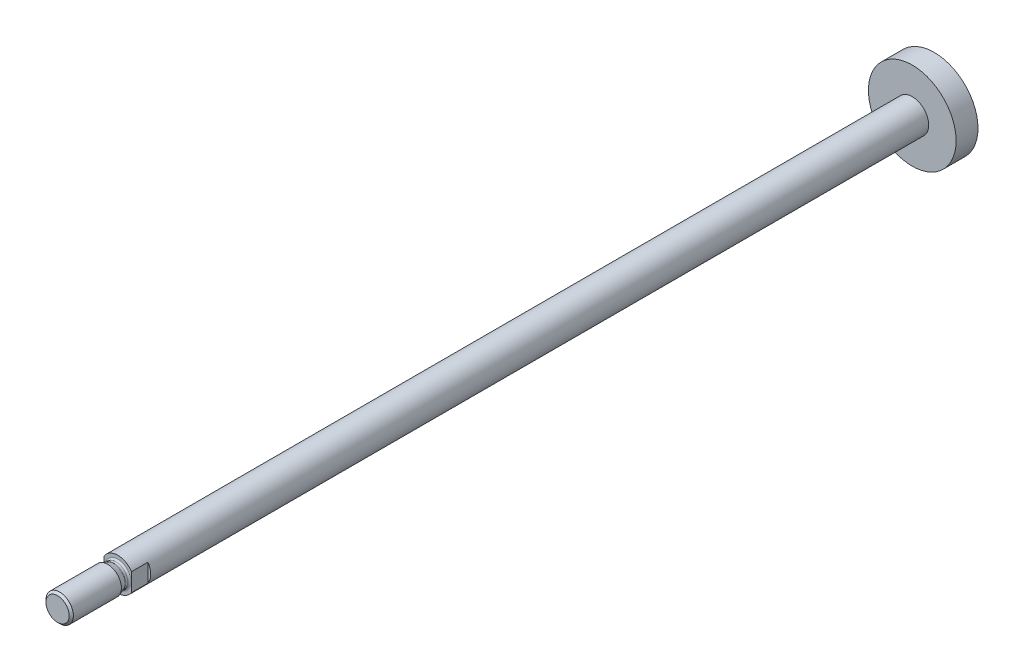
ISO-10303-21;
HEADER;
FILE_DESCRIPTION(('STEP AP214'),'2;1');
FILE_NAME('part.step','',(''),(''),'','','');
FILE_SCHEMA(('AUTOMOTIVE_DESIGN { 1 0 10303 214 1 1 1 1 }'));
ENDSEC;
DATA;
#1=APPLICATION_CONTEXT('core data for automotive mechanical design processes');
#2=APPLICATION_PROTOCOL_DEFINITION('international standard','automotive_design',2000,#1);
#3=PRODUCT_CONTEXT('',#1,'mechanical');
#4=PRODUCT('Part','Part','',(#3));
#5=PRODUCT_RELATED_PRODUCT_CATEGORY('part','',(#4));
#6=PRODUCT_DEFINITION_FORMATION('','',#4);
#7=PRODUCT_DEFINITION_CONTEXT('part definition',#1,'design');
#8=PRODUCT_DEFINITION('design','',#6,#7);
#9=PRODUCT_DEFINITION_SHAPE('','',#8);
#10=(LENGTH_UNIT() NAMED_UNIT(*) SI_UNIT(.MILLI.,.METRE.));
#11=(NAMED_UNIT(*) PLANE_ANGLE_UNIT() SI_UNIT($,.RADIAN.));
#12=(NAMED_UNIT(*) SI_UNIT($,.STERADIAN.) SOLID_ANGLE_UNIT());
#13=UNCERTAINTY_MEASURE_WITH_UNIT(LENGTH_MEASURE(1.E-05),#10,'distance_accuracy_value','');
#14=(GEOMETRIC_REPRESENTATION_CONTEXT(3) GLOBAL_UNCERTAINTY_ASSIGNED_CONTEXT((#13)) GLOBAL_UNIT_ASSIGNED_CONTEXT((#10,
#11,#12)) REPRESENTATION_CONTEXT('',''));
#15=CARTESIAN_POINT('',(0.,0.,0.));
#16=DIRECTION('',(0.,0.,1.));
#17=DIRECTION('',(1.,0.,0.));
#18=AXIS2_PLACEMENT_3D('',#15,#16,#17);
#19=CARTESIAN_POINT('',(0.,0.,8.));
#20=DIRECTION('',(0.,0.,-1.));
#21=DIRECTION('',(-1.,0.,0.));
#22=AXIS2_PLACEMENT_3D('',#19,#20,#21);
#23=PLANE('',#22);
#24=CARTESIAN_POINT('',(0.,0.,8.));
#25=DIRECTION('',(0.,0.,1.));
#26=DIRECTION('',(1.,0.,0.));
#27=AXIS2_PLACEMENT_3D('',#24,#25,#26);
#28=CIRCLE('',#27,4.8000000000001);
#29=CARTESIAN_POINT('',(4.8000000000001,0.,8.));
#30=VERTEX_POINT('',#29);
#31=EDGE_CURVE('E81',#30,#30,#28,.T.);
#32=ORIENTED_EDGE('',*,*,#31,.F.);
#33=EDGE_LOOP('',(#32));
#34=FACE_BOUND('',#33,.T.);
#35=DIRECTION('',(0.,1.,0.));
#36=VECTOR('',#35,1.);
#37=CARTESIAN_POINT('',(-5.,0.,8.));
#38=LINE('',#37,#36);
#39=CARTESIAN_POINT('',(-5.,-3.3166247903554,8.00000000000001));
#40=VERTEX_POINT('',#39);
#41=CARTESIAN_POINT('',(-5.,3.3166247903554,8.00000000000001));
#42=VERTEX_POINT('',#41);
#43=EDGE_CURVE('E102',#40,#42,#38,.T.);
#44=ORIENTED_EDGE('',*,*,#43,.F.);
#45=CARTESIAN_POINT('',(0.,0.,8.00000000000001));
#46=DIRECTION('',(0.,0.,1.));
#47=DIRECTION('',(1.,0.,0.));
#48=AXIS2_PLACEMENT_3D('',#45,#46,#47);
#49=CIRCLE('',#48,6.);
#50=CARTESIAN_POINT('',(5.,-3.3166247903554,8.00000000000001));
#51=VERTEX_POINT('',#50);
#52=EDGE_CURVE('E125',#40,#51,#49,.T.);
#53=ORIENTED_EDGE('',*,*,#52,.T.);
#54=DIRECTION('',(0.,-1.,0.));
#55=VECTOR('',#54,1.);
#56=CARTESIAN_POINT('',(5.,0.,8.));
#57=LINE('',#56,#55);
#58=CARTESIAN_POINT('',(5.,3.3166247903554,8.00000000000001));
#59=VERTEX_POINT('',#58);
#60=EDGE_CURVE('E88',#59,#51,#57,.T.);
#61=ORIENTED_EDGE('',*,*,#60,.F.);
#62=EDGE_CURVE('E95',#59,#42,#49,.T.);
#63=ORIENTED_EDGE('',*,*,#62,.T.);
#64=EDGE_LOOP('',(#44,#53,#61,#63));
#65=FACE_BOUND('',#64,.T.);
#66=ADVANCED_FACE('F38',(#34,#65),#23,.F.);
#67=CARTESIAN_POINT('',(0.,0.,-290.));
#68=DIRECTION('',(0.,0.,1.));
#69=DIRECTION('',(1.,0.,0.));
#70=AXIS2_PLACEMENT_3D('',#67,#68,#69);
#71=CYLINDRICAL_SURFACE('',#70,6.);
#72=CARTESIAN_POINT('',(0.,0.,-282.));
#73=DIRECTION('',(0.,0.,1.));
#74=DIRECTION('',(1.,0.,0.));
#75=AXIS2_PLACEMENT_3D('',#72,#73,#74);
#76=CIRCLE('',#75,6.);
#77=CARTESIAN_POINT('',(6.,0.,-282.));
#78=VERTEX_POINT('',#77);
#79=EDGE_CURVE('E128',#78,#78,#76,.T.);
#80=ORIENTED_EDGE('',*,*,#79,.T.);
#81=EDGE_LOOP('',(#80));
#82=FACE_BOUND('',#81,.T.);
#83=DIRECTION('',(0.,0.,1.));
#84=VECTOR('',#83,1.);
#85=CARTESIAN_POINT('',(-5.,-3.3166247903554,-290.));
#86=LINE('',#85,#84);
#87=CARTESIAN_POINT('',(-5.,-3.3166247903554,2.));
#88=VERTEX_POINT('',#87);
#89=EDGE_CURVE('E11',#88,#40,#86,.T.);
#90=ORIENTED_EDGE('',*,*,#89,.F.);
#91=CARTESIAN_POINT('',(0.,0.,2.));
#92=DIRECTION('',(0.,0.,1.));
#93=DIRECTION('',(1.,0.,0.));
#94=AXIS2_PLACEMENT_3D('',#91,#92,#93);
#95=CIRCLE('',#94,6.);
#96=CARTESIAN_POINT('',(-5.,3.3166247903554,2.));
#97=VERTEX_POINT('',#96);
#98=EDGE_CURVE('E83',#97,#88,#95,.T.);
#99=ORIENTED_EDGE('',*,*,#98,.F.);
#100=DIRECTION('',(0.,0.,1.));
#101=VECTOR('',#100,1.);
#102=CARTESIAN_POINT('',(-5.,3.3166247903554,-290.));
#103=LINE('',#102,#101);
#104=EDGE_CURVE('E45',#42,#97,#103,.F.);
#105=ORIENTED_EDGE('',*,*,#104,.F.);
#106=ORIENTED_EDGE('',*,*,#62,.F.);
#107=DIRECTION('',(0.,0.,1.));
#108=VECTOR('',#107,1.);
#109=CARTESIAN_POINT('',(5.,3.3166247903554,-290.));
#110=LINE('',#109,#108);
#111=CARTESIAN_POINT('',(5.,3.3166247903554,2.));
#112=VERTEX_POINT('',#111);
#113=EDGE_CURVE('E86',#112,#59,#110,.T.);
#114=ORIENTED_EDGE('',*,*,#113,.F.);
#115=CARTESIAN_POINT('',(5.,-3.3166247903554,2.));
#116=VERTEX_POINT('',#115);
#117=EDGE_CURVE('E75',#116,#112,#95,.T.);
#118=ORIENTED_EDGE('',*,*,#117,.F.);
#119=DIRECTION('',(0.,0.,1.));
#120=VECTOR('',#119,1.);
#121=CARTESIAN_POINT('',(5.,-3.3166247903554,-290.));
#122=LINE('',#121,#120);
#123=EDGE_CURVE('E80',#51,#116,#122,.F.);
#124=ORIENTED_EDGE('',*,*,#123,.F.);
#125=ORIENTED_EDGE('',*,*,#52,.F.);
#126=EDGE_LOOP('',(#90,#99,#105,#106,#114,#118,#124,#125));
#127=FACE_BOUND('',#126,.T.);
#128=ADVANCED_FACE('F92',(#82,#127),#71,.T.);
#129=CARTESIAN_POINT('',(0.,6.,-282.));
#130=DIRECTION('',(0.,0.,-1.));
#131=DIRECTION('',(-1.,0.,0.));
#132=AXIS2_PLACEMENT_3D('',#129,#130,#131);
#133=PLANE('',#132);
#134=ORIENTED_EDGE('',*,*,#79,.F.);
#135=EDGE_LOOP('',(#134));
#136=FACE_BOUND('',#135,.T.);
#137=CARTESIAN_POINT('',(0.,0.,-282.));
#138=DIRECTION('',(0.,0.,1.));
#139=DIRECTION('',(1.,0.,0.));
#140=AXIS2_PLACEMENT_3D('',#137,#138,#139);
#141=CIRCLE('',#140,16.);
#142=CARTESIAN_POINT('',(16.,0.,-282.));
#143=VERTEX_POINT('',#142);
#144=EDGE_CURVE('E131',#143,#143,#141,.T.);
#145=ORIENTED_EDGE('',*,*,#144,.T.);
#146=EDGE_LOOP('',(#145));
#147=FACE_BOUND('',#146,.T.);
#148=ADVANCED_FACE('F119',(#136,#147),#133,.F.);
#149=CARTESIAN_POINT('',(0.,0.,-290.));
#150=DIRECTION('',(0.,0.,1.));
#151=DIRECTION('',(1.,0.,0.));
#152=AXIS2_PLACEMENT_3D('',#149,#150,#151);
#153=CYLINDRICAL_SURFACE('',#152,16.);
#154=ORIENTED_EDGE('',*,*,#144,.F.);
#155=EDGE_LOOP('',(#154));
#156=FACE_BOUND('',#155,.T.);
#157=CARTESIAN_POINT('',(0.,0.,-290.));
#158=DIRECTION('',(0.,0.,1.));
#159=DIRECTION('',(1.,0.,0.));
#160=AXIS2_PLACEMENT_3D('',#157,#158,#159);
#161=CIRCLE('',#160,16.);
#162=CARTESIAN_POINT('',(16.,0.,-290.));
#163=VERTEX_POINT('',#162);
#164=EDGE_CURVE('E166',#163,#163,#161,.T.);
#165=ORIENTED_EDGE('',*,*,#164,.T.);
#166=EDGE_LOOP('',(#165));
#167=FACE_BOUND('',#166,.T.);
#168=ADVANCED_FACE('F149',(#156,#167),#153,.T.);
#169=CARTESIAN_POINT('',(0.,16.,-290.));
#170=DIRECTION('',(0.,0.,1.));
#171=DIRECTION('',(1.,0.,0.));
#172=AXIS2_PLACEMENT_3D('',#169,#170,#171);
#173=PLANE('',#172);
#174=ORIENTED_EDGE('',*,*,#164,.F.);
#175=EDGE_LOOP('',(#174));
#176=FACE_BOUND('',#175,.T.);
#177=ADVANCED_FACE('F139',(#176),#173,.F.);
#178=CARTESIAN_POINT('',(0.,0.,8.6000000000001));
#179=DIRECTION('',(0.,0.,1.));
#180=DIRECTION('',(1.,0.,0.));
#181=AXIS2_PLACEMENT_3D('',#178,#179,#180);
#182=TOROIDAL_SURFACE('',#181,4.8000000000001,0.600000000000098);
#183=CARTESIAN_POINT('',(0.,0.,8.6));
#184=DIRECTION('',(0.,0.,1.));
#185=DIRECTION('',(1.,0.,0.));
#186=AXIS2_PLACEMENT_3D('',#183,#184,#185);
#187=CIRCLE('',#186,4.2);
#188=CARTESIAN_POINT('',(4.2,0.,8.6));
#189=VERTEX_POINT('',#188);
#190=EDGE_CURVE('E168',#189,#189,#187,.T.);
#191=ORIENTED_EDGE('',*,*,#190,.F.);
#192=EDGE_LOOP('',(#191));
#193=FACE_BOUND('',#192,.T.);
#194=ORIENTED_EDGE('',*,*,#31,.T.);
#195=EDGE_LOOP('',(#194));
#196=FACE_BOUND('',#195,.T.);
#197=ADVANCED_FACE('F136',(#193,#196),#182,.F.);
#198=CARTESIAN_POINT('',(0.,0.,7.));
#199=DIRECTION('',(0.,0.,1.));
#200=DIRECTION('',(1.,0.,0.));
#201=AXIS2_PLACEMENT_3D('',#198,#199,#200);
#202=CYLINDRICAL_SURFACE('',#201,4.2);
#203=CARTESIAN_POINT('',(0.,0.,9.3942038115749));
#204=DIRECTION('',(0.,0.,1.));
#205=DIRECTION('',(1.,0.,0.));
#206=AXIS2_PLACEMENT_3D('',#203,#204,#205);
#207=CIRCLE('',#206,4.2);
#208=CARTESIAN_POINT('',(4.2,0.,9.3942038115749));
#209=VERTEX_POINT('',#208);
#210=EDGE_CURVE('E173',#209,#209,#207,.T.);
#211=ORIENTED_EDGE('',*,*,#210,.F.);
#212=EDGE_LOOP('',(#211));
#213=FACE_BOUND('',#212,.T.);
#214=ORIENTED_EDGE('',*,*,#190,.T.);
#215=EDGE_LOOP('',(#214));
#216=FACE_BOUND('',#215,.T.);
#217=ADVANCED_FACE('F138',(#213,#216),#202,.T.);
#218=CARTESIAN_POINT('',(0.,0.,9.39420381157482));
#219=DIRECTION('',(0.,0.,1.));
#220=DIRECTION('',(1.,0.,0.));
#221=AXIS2_PLACEMENT_3D('',#218,#219,#220);
#222=TOROIDAL_SURFACE('',#221,4.79999999999972,0.59999999999972);
#223=CARTESIAN_POINT('',(0.,0.,9.5994158975703));
#224=DIRECTION('',(0.,0.,1.));
#225=DIRECTION('',(1.,0.,0.));
#226=AXIS2_PLACEMENT_3D('',#223,#224,#225);
#227=CIRCLE('',#226,4.2361844275285);
#228=CARTESIAN_POINT('',(4.2361844275285,0.,9.5994158975703));
#229=VERTEX_POINT('',#228);
#230=EDGE_CURVE('E176',#229,#229,#227,.T.);
#231=ORIENTED_EDGE('',*,*,#230,.F.);
#232=EDGE_LOOP('',(#231));
#233=FACE_BOUND('',#232,.T.);
#234=ORIENTED_EDGE('',*,*,#210,.T.);
#235=EDGE_LOOP('',(#234));
#236=FACE_BOUND('',#235,.T.);
#237=ADVANCED_FACE('F146',(#233,#236),#222,.F.);
#238=CARTESIAN_POINT('',(0.,0.,9.5994158975703));
#239=DIRECTION('',(0.,0.,1.));
#240=DIRECTION('',(1.,0.,0.));
#241=AXIS2_PLACEMENT_3D('',#238,#239,#240);
#242=CONICAL_SURFACE('',#241,4.2361844275285,0.349065850398797);
#243=CARTESIAN_POINT('',(0.,0.,11.697981935564));
#244=DIRECTION('',(0.,0.,1.));
#245=DIRECTION('',(1.,0.,0.));
#246=AXIS2_PLACEMENT_3D('',#243,#244,#245);
#247=CIRCLE('',#246,5.);
#248=CARTESIAN_POINT('',(5.,0.,11.697981935564));
#249=VERTEX_POINT('',#248);
#250=EDGE_CURVE('E179',#249,#249,#247,.T.);
#251=ORIENTED_EDGE('',*,*,#250,.F.);
#252=EDGE_LOOP('',(#251));
#253=FACE_BOUND('',#252,.T.);
#254=ORIENTED_EDGE('',*,*,#230,.T.);
#255=EDGE_LOOP('',(#254));
#256=FACE_BOUND('',#255,.T.);
#257=ADVANCED_FACE('F200',(#253,#256),#242,.T.);
#258=CARTESIAN_POINT('',(0.,0.,7.));
#259=DIRECTION('',(0.,0.,1.));
#260=DIRECTION('',(1.,0.,0.));
#261=AXIS2_PLACEMENT_3D('',#258,#259,#260);
#262=CYLINDRICAL_SURFACE('',#261,5.);
#263=CARTESIAN_POINT('',(0.,0.,29.233));
#264=DIRECTION('',(0.,0.,1.));
#265=DIRECTION('',(1.,0.,0.));
#266=AXIS2_PLACEMENT_3D('',#263,#264,#265);
#267=CIRCLE('',#266,5.);
#268=CARTESIAN_POINT('',(5.,0.,29.233));
#269=VERTEX_POINT('',#268);
#270=EDGE_CURVE('E182',#269,#269,#267,.T.);
#271=ORIENTED_EDGE('',*,*,#270,.F.);
#272=EDGE_LOOP('',(#271));
#273=FACE_BOUND('',#272,.T.);
#274=ORIENTED_EDGE('',*,*,#250,.T.);
#275=EDGE_LOOP('',(#274));
#276=FACE_BOUND('',#275,.T.);
#277=ADVANCED_FACE('F194',(#273,#276),#262,.T.);
#278=CARTESIAN_POINT('',(0.,0.,29.233));
#279=DIRECTION('',(0.,0.,-1.));
#280=DIRECTION('',(-1.,0.,0.));
#281=AXIS2_PLACEMENT_3D('',#278,#279,#280);
#282=CONICAL_SURFACE('',#281,5.,0.785398163397451);
#283=CARTESIAN_POINT('',(0.,0.,30.));
#284=DIRECTION('',(0.,0.,1.));
#285=DIRECTION('',(1.,0.,0.));
#286=AXIS2_PLACEMENT_3D('',#283,#284,#285);
#287=CIRCLE('',#286,4.233);
#288=CARTESIAN_POINT('',(4.233,0.,30.));
#289=VERTEX_POINT('',#288);
#290=EDGE_CURVE('E126',#289,#289,#287,.T.);
#291=ORIENTED_EDGE('',*,*,#290,.F.);
#292=EDGE_LOOP('',(#291));
#293=FACE_BOUND('',#292,.T.);
#294=ORIENTED_EDGE('',*,*,#270,.T.);
#295=EDGE_LOOP('',(#294));
#296=FACE_BOUND('',#295,.T.);
#297=ADVANCED_FACE('F191',(#293,#296),#282,.T.);
#298=CARTESIAN_POINT('',(0.,0.,30.));
#299=DIRECTION('',(0.,0.,-1.));
#300=DIRECTION('',(-1.,0.,0.));
#301=AXIS2_PLACEMENT_3D('',#298,#299,#300);
#302=PLANE('',#301);
#303=ORIENTED_EDGE('',*,*,#290,.T.);
#304=EDGE_LOOP('',(#303));
#305=FACE_BOUND('',#304,.T.);
#306=ADVANCED_FACE('F113',(#305),#302,.F.);
#307=CARTESIAN_POINT('',(0.,0.,2.));
#308=DIRECTION('',(0.,0.,1.));
#309=DIRECTION('',(1.,0.,0.));
#310=AXIS2_PLACEMENT_3D('',#307,#308,#309);
#311=PLANE('',#310);
#312=ORIENTED_EDGE('',*,*,#117,.T.);
#313=DIRECTION('',(0.,-1.,0.));
#314=VECTOR('',#313,1.);
#315=CARTESIAN_POINT('',(5.,10.,2.));
#316=LINE('',#315,#314);
#317=EDGE_CURVE('E58',#112,#116,#316,.T.);
#318=ORIENTED_EDGE('',*,*,#317,.T.);
#319=EDGE_LOOP('',(#312,#318));
#320=FACE_BOUND('',#319,.T.);
#321=ADVANCED_FACE('F76',(#320),#311,.T.);
#322=CARTESIAN_POINT('',(5.,10.,9.));
#323=DIRECTION('',(1.,0.,0.));
#324=DIRECTION('',(0.,0.,-1.));
#325=AXIS2_PLACEMENT_3D('',#322,#323,#324);
#326=PLANE('',#325);
#327=ORIENTED_EDGE('',*,*,#113,.T.);
#328=ORIENTED_EDGE('',*,*,#60,.T.);
#329=ORIENTED_EDGE('',*,*,#123,.T.);
#330=ORIENTED_EDGE('',*,*,#317,.F.);
#331=EDGE_LOOP('',(#327,#328,#329,#330));
#332=FACE_BOUND('',#331,.T.);
#333=ADVANCED_FACE('F85',(#332),#326,.T.);
#334=CARTESIAN_POINT('',(-5.,-10.,9.));
#335=DIRECTION('',(-1.,0.,0.));
#336=DIRECTION('',(0.,0.,1.));
#337=AXIS2_PLACEMENT_3D('',#334,#335,#336);
#338=PLANE('',#337);
#339=ORIENTED_EDGE('',*,*,#89,.T.);
#340=ORIENTED_EDGE('',*,*,#43,.T.);
#341=ORIENTED_EDGE('',*,*,#104,.T.);
#342=DIRECTION('',(0.,1.,0.));
#343=VECTOR('',#342,1.);
#344=CARTESIAN_POINT('',(-5.,-10.,2.));
#345=LINE('',#344,#343);
#346=EDGE_CURVE('E51',#88,#97,#345,.T.);
#347=ORIENTED_EDGE('',*,*,#346,.F.);
#348=EDGE_LOOP('',(#339,#340,#341,#347));
#349=FACE_BOUND('',#348,.T.);
#350=ADVANCED_FACE('F100',(#349),#338,.T.);
#351=ORIENTED_EDGE('',*,*,#98,.T.);
#352=ORIENTED_EDGE('',*,*,#346,.T.);
#353=EDGE_LOOP('',(#351,#352));
#354=FACE_BOUND('',#353,.T.);
#355=ADVANCED_FACE('F104',(#354),#311,.T.);
#356=CLOSED_SHELL('',(#66,#128,#148,#168,#177,#197,#217,#237,#257,#277,#297,#306,#321,#333,#350,#355));
#357=MANIFOLD_SOLID_BREP('B2',#356);
#358=ADVANCED_BREP_SHAPE_REPRESENTATION('',(#18,#357),#14);
#359=SHAPE_DEFINITION_REPRESENTATION(#9,#358);
ENDSEC;
END-ISO-10303-21;
